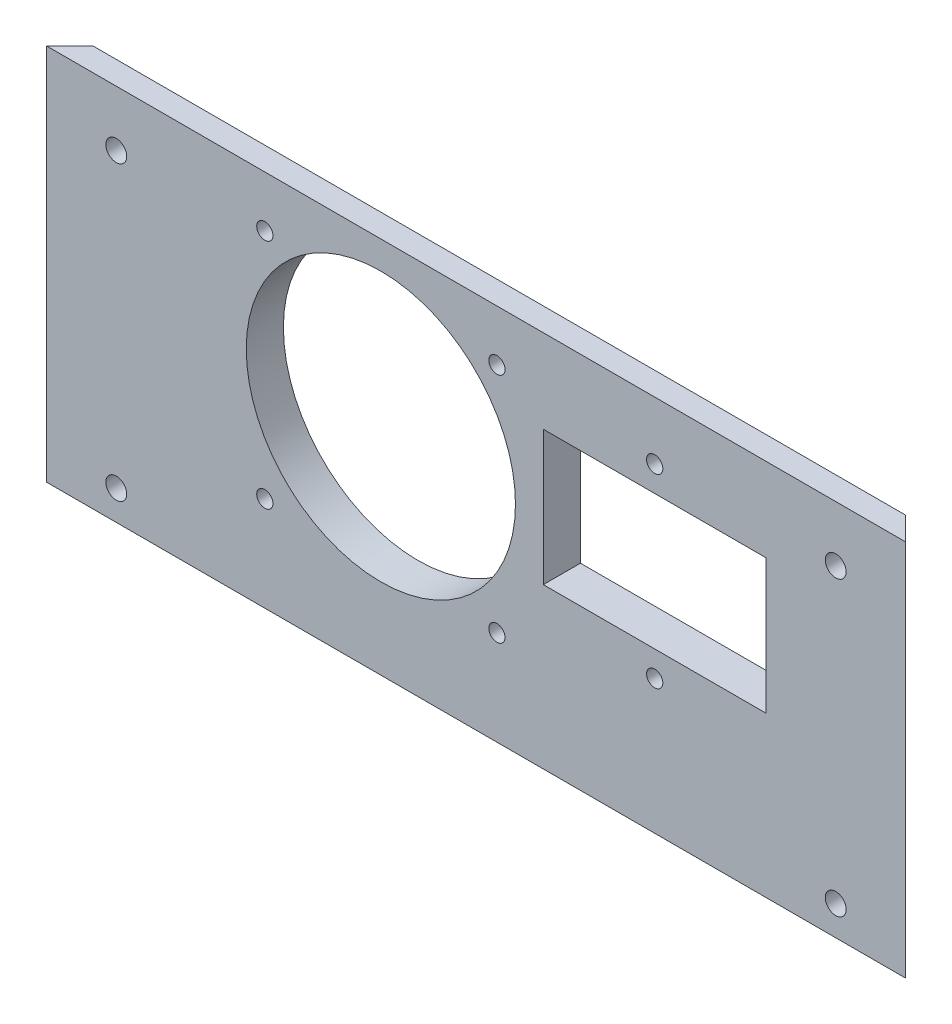
ISO-10303-21;
HEADER;
FILE_DESCRIPTION(('STEP AP214'),'2;1');
FILE_NAME('part.step','',(''),(''),'','','');
FILE_SCHEMA(('AUTOMOTIVE_DESIGN { 1 0 10303 214 1 1 1 1 }'));
ENDSEC;
DATA;
#1=APPLICATION_CONTEXT('core data for automotive mechanical design processes');
#2=APPLICATION_PROTOCOL_DEFINITION('international standard','automotive_design',2000,#1);
#3=PRODUCT_CONTEXT('',#1,'mechanical');
#4=PRODUCT('Part','Part','',(#3));
#5=PRODUCT_RELATED_PRODUCT_CATEGORY('part','',(#4));
#6=PRODUCT_DEFINITION_FORMATION('','',#4);
#7=PRODUCT_DEFINITION_CONTEXT('part definition',#1,'design');
#8=PRODUCT_DEFINITION('design','',#6,#7);
#9=PRODUCT_DEFINITION_SHAPE('','',#8);
#10=(LENGTH_UNIT() NAMED_UNIT(*) SI_UNIT(.MILLI.,.METRE.));
#11=(NAMED_UNIT(*) PLANE_ANGLE_UNIT() SI_UNIT($,.RADIAN.));
#12=(NAMED_UNIT(*) SI_UNIT($,.STERADIAN.) SOLID_ANGLE_UNIT());
#13=UNCERTAINTY_MEASURE_WITH_UNIT(LENGTH_MEASURE(1.E-05),#10,'distance_accuracy_value','');
#14=(GEOMETRIC_REPRESENTATION_CONTEXT(3) GLOBAL_UNCERTAINTY_ASSIGNED_CONTEXT((#13)) GLOBAL_UNIT_ASSIGNED_CONTEXT((#10,
#11,#12)) REPRESENTATION_CONTEXT('',''));
#15=CARTESIAN_POINT('',(0.,0.,0.));
#16=DIRECTION('',(0.,0.,1.));
#17=DIRECTION('',(1.,0.,0.));
#18=AXIS2_PLACEMENT_3D('',#15,#16,#17);
#19=CARTESIAN_POINT('',(0.,84.,-5.));
#20=DIRECTION('',(0.,1.,0.));
#21=DIRECTION('',(0.,0.,1.));
#22=AXIS2_PLACEMENT_3D('',#19,#20,#21);
#23=PLANE('',#22);
#24=DIRECTION('',(-0.707106781186546,0.,-0.707106781186549));
#25=VECTOR('',#24,1.);
#26=CARTESIAN_POINT('',(90.0000000000003,84.,-95.));
#27=LINE('',#26,#25);
#28=CARTESIAN_POINT('',(185.,84.,0.));
#29=VERTEX_POINT('',#28);
#30=CARTESIAN_POINT('',(180.,84.,-4.99999999999999));
#31=VERTEX_POINT('',#30);
#32=EDGE_CURVE('E261',#29,#31,#27,.T.);
#33=ORIENTED_EDGE('',*,*,#32,.T.);
#34=DIRECTION('',(-1.,0.,0.));
#35=VECTOR('',#34,1.);
#36=CARTESIAN_POINT('',(8.00000000000001,84.,-5.));
#37=LINE('',#36,#35);
#38=CARTESIAN_POINT('',(5.00000000000002,84.,-5.));
#39=VERTEX_POINT('',#38);
#40=EDGE_CURVE('E272',#31,#39,#37,.T.);
#41=ORIENTED_EDGE('',*,*,#40,.T.);
#42=DIRECTION('',(-0.707106781186546,0.,0.707106781186549));
#43=VECTOR('',#42,1.);
#44=CARTESIAN_POINT('',(2.50000000000002,84.,-2.49999999999999));
#45=LINE('',#44,#43);
#46=CARTESIAN_POINT('',(0.,84.,0.));
#47=VERTEX_POINT('',#46);
#48=EDGE_CURVE('E258',#39,#47,#45,.T.);
#49=ORIENTED_EDGE('',*,*,#48,.T.);
#50=DIRECTION('',(-1.,0.,0.));
#51=VECTOR('',#50,1.);
#52=CARTESIAN_POINT('',(0.,84.,0.));
#53=LINE('',#52,#51);
#54=EDGE_CURVE('E234',#29,#47,#53,.T.);
#55=ORIENTED_EDGE('',*,*,#54,.F.);
#56=EDGE_LOOP('',(#33,#41,#49,#55));
#57=FACE_BOUND('',#56,.T.);
#58=ADVANCED_FACE('F41',(#57),#23,.T.);
#59=CARTESIAN_POINT('',(0.,0.,-5.));
#60=DIRECTION('',(0.,0.,-1.));
#61=DIRECTION('',(-1.,0.,0.));
#62=AXIS2_PLACEMENT_3D('',#59,#60,#61);
#63=PLANE('',#62);
#64=DIRECTION('',(1.,0.,0.));
#65=VECTOR('',#64,1.);
#66=CARTESIAN_POINT('',(-4.99999999999998,2.59999999999997,-4.99999999999985));
#67=LINE('',#66,#65);
#68=CARTESIAN_POINT('',(4.99999999999987,2.59999999999997,-4.99999999999985));
#69=VERTEX_POINT('',#68);
#70=CARTESIAN_POINT('',(180.,2.59999999999997,-4.99999999999985));
#71=VERTEX_POINT('',#70);
#72=EDGE_CURVE('E180',#69,#71,#67,.T.);
#73=ORIENTED_EDGE('',*,*,#72,.F.);
#74=DIRECTION('',(0.,1.,0.));
#75=VECTOR('',#74,1.);
#76=CARTESIAN_POINT('',(5.00000000000002,0.,-5.));
#77=LINE('',#76,#75);
#78=CARTESIAN_POINT('',(5.00000000000002,5.,-5.));
#79=VERTEX_POINT('',#78);
#80=EDGE_CURVE('E251',#69,#79,#77,.T.);
#81=ORIENTED_EDGE('',*,*,#80,.T.);
#82=DIRECTION('',(-1.,0.,0.));
#83=VECTOR('',#82,1.);
#84=CARTESIAN_POINT('',(0.,5.,-5.));
#85=LINE('',#84,#83);
#86=CARTESIAN_POINT('',(180.,4.99999999999997,-5.));
#87=VERTEX_POINT('',#86);
#88=EDGE_CURVE('E203',#87,#79,#85,.T.);
#89=ORIENTED_EDGE('',*,*,#88,.F.);
#90=DIRECTION('',(0.,-1.,0.));
#91=VECTOR('',#90,1.);
#92=CARTESIAN_POINT('',(180.,0.,-5.));
#93=LINE('',#92,#91);
#94=EDGE_CURVE('E254',#87,#71,#93,.T.);
#95=ORIENTED_EDGE('',*,*,#94,.T.);
#96=EDGE_LOOP('',(#73,#81,#89,#95));
#97=FACE_BOUND('',#96,.T.);
#98=ADVANCED_FACE('F304',(#97),#63,.T.);
#99=CARTESIAN_POINT('',(0.,0.,0.));
#100=DIRECTION('',(0.,0.,-1.));
#101=DIRECTION('',(-1.,0.,0.));
#102=AXIS2_PLACEMENT_3D('',#99,#100,#101);
#103=PLANE('',#102);
#104=CARTESIAN_POINT('',(97.0000000000003,23.,0.));
#105=DIRECTION('',(0.,0.,1.));
#106=DIRECTION('',(1.,0.,0.));
#107=AXIS2_PLACEMENT_3D('',#104,#105,#106);
#108=CIRCLE('',#107,1.75);
#109=CARTESIAN_POINT('',(98.7500000000003,23.,0.));
#110=VERTEX_POINT('',#109);
#111=EDGE_CURVE('E402',#110,#110,#108,.T.);
#112=ORIENTED_EDGE('',*,*,#111,.F.);
#113=EDGE_LOOP('',(#112));
#114=FACE_BOUND('',#113,.T.);
#115=CARTESIAN_POINT('',(96.9999999999998,73.,0.));
#116=DIRECTION('',(0.,0.,1.));
#117=DIRECTION('',(1.,0.,0.));
#118=AXIS2_PLACEMENT_3D('',#115,#116,#117);
#119=CIRCLE('',#118,1.75);
#120=CARTESIAN_POINT('',(98.7499999999998,73.,0.));
#121=VERTEX_POINT('',#120);
#122=EDGE_CURVE('E419',#121,#121,#119,.T.);
#123=ORIENTED_EDGE('',*,*,#122,.F.);
#124=EDGE_LOOP('',(#123));
#125=FACE_BOUND('',#124,.T.);
#126=CARTESIAN_POINT('',(71.9999999999995,49.,0.));
#127=DIRECTION('',(0.,0.,1.));
#128=DIRECTION('',(1.,0.,0.));
#129=AXIS2_PLACEMENT_3D('',#126,#127,#128);
#130=CIRCLE('',#129,29.);
#131=CARTESIAN_POINT('',(101.,49.,0.));
#132=VERTEX_POINT('',#131);
#133=EDGE_CURVE('E153',#132,#132,#130,.T.);
#134=ORIENTED_EDGE('',*,*,#133,.F.);
#135=EDGE_LOOP('',(#134));
#136=FACE_BOUND('',#135,.T.);
#137=CARTESIAN_POINT('',(46.9999999999998,73.,0.));
#138=DIRECTION('',(0.,0.,1.));
#139=DIRECTION('',(1.,0.,0.));
#140=AXIS2_PLACEMENT_3D('',#137,#138,#139);
#141=CIRCLE('',#140,1.75);
#142=CARTESIAN_POINT('',(48.7499999999998,73.,0.));
#143=VERTEX_POINT('',#142);
#144=EDGE_CURVE('E418',#143,#143,#141,.T.);
#145=ORIENTED_EDGE('',*,*,#144,.F.);
#146=EDGE_LOOP('',(#145));
#147=FACE_BOUND('',#146,.T.);
#148=CARTESIAN_POINT('',(131.,31.5,0.));
#149=DIRECTION('',(0.,0.,1.));
#150=DIRECTION('',(1.,0.,0.));
#151=AXIS2_PLACEMENT_3D('',#148,#149,#150);
#152=CIRCLE('',#151,1.75000000000001);
#153=CARTESIAN_POINT('',(132.75,31.5,0.));
#154=VERTEX_POINT('',#153);
#155=EDGE_CURVE('E390',#154,#154,#152,.T.);
#156=ORIENTED_EDGE('',*,*,#155,.F.);
#157=EDGE_LOOP('',(#156));
#158=FACE_BOUND('',#157,.T.);
#159=CARTESIAN_POINT('',(131.,71.5,0.));
#160=DIRECTION('',(0.,0.,1.));
#161=DIRECTION('',(1.,0.,0.));
#162=AXIS2_PLACEMENT_3D('',#159,#160,#161);
#163=CIRCLE('',#162,1.75000000000001);
#164=CARTESIAN_POINT('',(132.75,71.5,0.));
#165=VERTEX_POINT('',#164);
#166=EDGE_CURVE('E395',#165,#165,#163,.T.);
#167=ORIENTED_EDGE('',*,*,#166,.F.);
#168=EDGE_LOOP('',(#167));
#169=FACE_BOUND('',#168,.T.);
#170=CARTESIAN_POINT('',(47.0000000000003,23.,0.));
#171=DIRECTION('',(0.,0.,1.));
#172=DIRECTION('',(1.,0.,0.));
#173=AXIS2_PLACEMENT_3D('',#170,#171,#172);
#174=CIRCLE('',#173,1.75);
#175=CARTESIAN_POINT('',(48.7500000000003,23.,0.));
#176=VERTEX_POINT('',#175);
#177=EDGE_CURVE('E403',#176,#176,#174,.T.);
#178=ORIENTED_EDGE('',*,*,#177,.F.);
#179=EDGE_LOOP('',(#178));
#180=FACE_BOUND('',#179,.T.);
#181=DIRECTION('',(1.,0.,0.));
#182=VECTOR('',#181,1.);
#183=CARTESIAN_POINT('',(107.,37.,0.));
#184=LINE('',#183,#182);
#185=CARTESIAN_POINT('',(107.,37.,0.));
#186=VERTEX_POINT('',#185);
#187=CARTESIAN_POINT('',(155.,37.,0.));
#188=VERTEX_POINT('',#187);
#189=EDGE_CURVE('E162',#186,#188,#184,.T.);
#190=ORIENTED_EDGE('',*,*,#189,.F.);
#191=DIRECTION('',(0.,-1.,0.));
#192=VECTOR('',#191,1.);
#193=CARTESIAN_POINT('',(107.,37.,0.));
#194=LINE('',#193,#192);
#195=CARTESIAN_POINT('',(107.,66.,0.));
#196=VERTEX_POINT('',#195);
#197=EDGE_CURVE('E58',#196,#186,#194,.T.);
#198=ORIENTED_EDGE('',*,*,#197,.F.);
#199=DIRECTION('',(-1.,0.,0.));
#200=VECTOR('',#199,1.);
#201=CARTESIAN_POINT('',(107.,66.,0.));
#202=LINE('',#201,#200);
#203=CARTESIAN_POINT('',(155.,66.,0.));
#204=VERTEX_POINT('',#203);
#205=EDGE_CURVE('E146',#204,#196,#202,.T.);
#206=ORIENTED_EDGE('',*,*,#205,.F.);
#207=DIRECTION('',(0.,1.,0.));
#208=VECTOR('',#207,1.);
#209=CARTESIAN_POINT('',(155.,37.,0.));
#210=LINE('',#209,#208);
#211=EDGE_CURVE('E150',#188,#204,#210,.T.);
#212=ORIENTED_EDGE('',*,*,#211,.F.);
#213=EDGE_LOOP('',(#190,#198,#206,#212));
#214=FACE_BOUND('',#213,.T.);
#215=CARTESIAN_POINT('',(170.,72.,0.));
#216=DIRECTION('',(0.,0.,1.));
#217=DIRECTION('',(-1.,0.,0.));
#218=AXIS2_PLACEMENT_3D('',#215,#216,#217);
#219=CIRCLE('',#218,2.25000000000004);
#220=CARTESIAN_POINT('',(167.75,72.,0.));
#221=VERTEX_POINT('',#220);
#222=EDGE_CURVE('E208',#221,#221,#219,.T.);
#223=ORIENTED_EDGE('',*,*,#222,.F.);
#224=EDGE_LOOP('',(#223));
#225=FACE_BOUND('',#224,.T.);
#226=CARTESIAN_POINT('',(15.,72.,0.));
#227=DIRECTION('',(0.,0.,1.));
#228=DIRECTION('',(1.,0.,0.));
#229=AXIS2_PLACEMENT_3D('',#226,#227,#228);
#230=CIRCLE('',#229,2.25000000000001);
#231=CARTESIAN_POINT('',(17.25,72.,0.));
#232=VERTEX_POINT('',#231);
#233=EDGE_CURVE('E215',#232,#232,#230,.T.);
#234=ORIENTED_EDGE('',*,*,#233,.F.);
#235=EDGE_LOOP('',(#234));
#236=FACE_BOUND('',#235,.T.);
#237=CARTESIAN_POINT('',(170.,9.,0.));
#238=DIRECTION('',(0.,0.,1.));
#239=DIRECTION('',(-1.,0.,0.));
#240=AXIS2_PLACEMENT_3D('',#237,#238,#239);
#241=CIRCLE('',#240,2.25000000000004);
#242=CARTESIAN_POINT('',(167.75,9.,0.));
#243=VERTEX_POINT('',#242);
#244=EDGE_CURVE('E219',#243,#243,#241,.T.);
#245=ORIENTED_EDGE('',*,*,#244,.F.);
#246=EDGE_LOOP('',(#245));
#247=FACE_BOUND('',#246,.T.);
#248=CARTESIAN_POINT('',(15.,9.,0.));
#249=DIRECTION('',(0.,0.,1.));
#250=DIRECTION('',(1.,0.,0.));
#251=AXIS2_PLACEMENT_3D('',#248,#249,#250);
#252=CIRCLE('',#251,2.25);
#253=CARTESIAN_POINT('',(17.25,9.,0.));
#254=VERTEX_POINT('',#253);
#255=EDGE_CURVE('E223',#254,#254,#252,.T.);
#256=ORIENTED_EDGE('',*,*,#255,.F.);
#257=EDGE_LOOP('',(#256));
#258=FACE_BOUND('',#257,.T.);
#259=DIRECTION('',(0.,-1.,0.));
#260=VECTOR('',#259,1.);
#261=CARTESIAN_POINT('',(0.,0.,0.));
#262=LINE('',#261,#260);
#263=CARTESIAN_POINT('',(0.,2.59999999999997,0.));
#264=VERTEX_POINT('',#263);
#265=EDGE_CURVE('E227',#47,#264,#262,.T.);
#266=ORIENTED_EDGE('',*,*,#265,.T.);
#267=DIRECTION('',(1.,0.,0.));
#268=VECTOR('',#267,1.);
#269=CARTESIAN_POINT('',(0.,2.59999999999997,1.66533453693773E-13));
#270=LINE('',#269,#268);
#271=CARTESIAN_POINT('',(185.,2.59999999999997,1.66533453693773E-13));
#272=VERTEX_POINT('',#271);
#273=EDGE_CURVE('E181',#264,#272,#270,.T.);
#274=ORIENTED_EDGE('',*,*,#273,.T.);
#275=DIRECTION('',(0.,1.,0.));
#276=VECTOR('',#275,1.);
#277=CARTESIAN_POINT('',(185.,0.,0.));
#278=LINE('',#277,#276);
#279=EDGE_CURVE('E231',#272,#29,#278,.T.);
#280=ORIENTED_EDGE('',*,*,#279,.T.);
#281=ORIENTED_EDGE('',*,*,#54,.T.);
#282=EDGE_LOOP('',(#266,#274,#280,#281));
#283=FACE_BOUND('',#282,.T.);
#284=ADVANCED_FACE('F298',(#114,#125,#136,#147,#158,#169,#180,#214,#225,#236,#247,#258,#283),
#103,.F.);
#285=CARTESIAN_POINT('',(15.,9.,-5.));
#286=DIRECTION('',(0.,0.,1.));
#287=DIRECTION('',(1.,0.,0.));
#288=AXIS2_PLACEMENT_3D('',#285,#286,#287);
#289=CYLINDRICAL_SURFACE('',#288,2.25);
#290=ORIENTED_EDGE('',*,*,#255,.T.);
#291=EDGE_LOOP('',(#290));
#292=FACE_BOUND('',#291,.T.);
#293=CARTESIAN_POINT('',(15.,9.,-8.));
#294=DIRECTION('',(0.,0.,-1.));
#295=DIRECTION('',(-1.,0.,0.));
#296=AXIS2_PLACEMENT_3D('',#293,#294,#295);
#297=CIRCLE('',#296,2.25);
#298=CARTESIAN_POINT('',(12.75,9.,-8.));
#299=VERTEX_POINT('',#298);
#300=EDGE_CURVE('E195',#299,#299,#297,.T.);
#301=ORIENTED_EDGE('',*,*,#300,.T.);
#302=EDGE_LOOP('',(#301));
#303=FACE_BOUND('',#302,.T.);
#304=ADVANCED_FACE('F447',(#292,#303),#289,.F.);
#305=CARTESIAN_POINT('',(170.,9.,-5.));
#306=DIRECTION('',(0.,0.,1.));
#307=DIRECTION('',(1.,0.,0.));
#308=AXIS2_PLACEMENT_3D('',#305,#306,#307);
#309=CYLINDRICAL_SURFACE('',#308,2.25000000000004);
#310=ORIENTED_EDGE('',*,*,#244,.T.);
#311=EDGE_LOOP('',(#310));
#312=FACE_BOUND('',#311,.T.);
#313=CARTESIAN_POINT('',(170.,9.,-8.));
#314=DIRECTION('',(0.,0.,-1.));
#315=DIRECTION('',(-1.,0.,0.));
#316=AXIS2_PLACEMENT_3D('',#313,#314,#315);
#317=CIRCLE('',#316,2.25000000000004);
#318=CARTESIAN_POINT('',(167.75,9.,-8.));
#319=VERTEX_POINT('',#318);
#320=EDGE_CURVE('E191',#319,#319,#317,.T.);
#321=ORIENTED_EDGE('',*,*,#320,.T.);
#322=EDGE_LOOP('',(#321));
#323=FACE_BOUND('',#322,.T.);
#324=ADVANCED_FACE('F467',(#312,#323),#309,.F.);
#325=CARTESIAN_POINT('',(15.,72.,-5.));
#326=DIRECTION('',(0.,0.,1.));
#327=DIRECTION('',(1.,0.,0.));
#328=AXIS2_PLACEMENT_3D('',#325,#326,#327);
#329=CYLINDRICAL_SURFACE('',#328,2.25000000000001);
#330=ORIENTED_EDGE('',*,*,#233,.T.);
#331=EDGE_LOOP('',(#330));
#332=FACE_BOUND('',#331,.T.);
#333=CARTESIAN_POINT('',(15.,72.,-8.));
#334=DIRECTION('',(0.,0.,-1.));
#335=DIRECTION('',(-1.,0.,0.));
#336=AXIS2_PLACEMENT_3D('',#333,#334,#335);
#337=CIRCLE('',#336,2.25000000000001);
#338=CARTESIAN_POINT('',(12.75,72.,-8.));
#339=VERTEX_POINT('',#338);
#340=EDGE_CURVE('E199',#339,#339,#337,.T.);
#341=ORIENTED_EDGE('',*,*,#340,.T.);
#342=EDGE_LOOP('',(#341));
#343=FACE_BOUND('',#342,.T.);
#344=ADVANCED_FACE('F477',(#332,#343),#329,.F.);
#345=CARTESIAN_POINT('',(170.,72.,-5.));
#346=DIRECTION('',(0.,0.,1.));
#347=DIRECTION('',(1.,0.,0.));
#348=AXIS2_PLACEMENT_3D('',#345,#346,#347);
#349=CYLINDRICAL_SURFACE('',#348,2.25000000000004);
#350=ORIENTED_EDGE('',*,*,#222,.T.);
#351=EDGE_LOOP('',(#350));
#352=FACE_BOUND('',#351,.T.);
#353=CARTESIAN_POINT('',(170.,72.,-8.));
#354=DIRECTION('',(0.,0.,-1.));
#355=DIRECTION('',(-1.,0.,0.));
#356=AXIS2_PLACEMENT_3D('',#353,#354,#355);
#357=CIRCLE('',#356,2.25000000000004);
#358=CARTESIAN_POINT('',(167.75,72.,-8.));
#359=VERTEX_POINT('',#358);
#360=EDGE_CURVE('E185',#359,#359,#357,.T.);
#361=ORIENTED_EDGE('',*,*,#360,.T.);
#362=EDGE_LOOP('',(#361));
#363=FACE_BOUND('',#362,.T.);
#364=ADVANCED_FACE('F316',(#352,#363),#349,.F.);
#365=CARTESIAN_POINT('',(0.,0.,-8.));
#366=DIRECTION('',(0.,0.,1.));
#367=DIRECTION('',(1.,0.,0.));
#368=AXIS2_PLACEMENT_3D('',#365,#366,#367);
#369=PLANE('',#368);
#370=CARTESIAN_POINT('',(97.0000000000003,23.,-8.));
#371=DIRECTION('',(0.,0.,1.));
#372=DIRECTION('',(1.,0.,0.));
#373=AXIS2_PLACEMENT_3D('',#370,#371,#372);
#374=CIRCLE('',#373,1.75);
#375=CARTESIAN_POINT('',(98.7500000000003,23.,-8.));
#376=VERTEX_POINT('',#375);
#377=EDGE_CURVE('E423',#376,#376,#374,.T.);
#378=ORIENTED_EDGE('',*,*,#377,.T.);
#379=EDGE_LOOP('',(#378));
#380=FACE_BOUND('',#379,.T.);
#381=CARTESIAN_POINT('',(96.9999999999998,73.,-8.));
#382=DIRECTION('',(0.,0.,1.));
#383=DIRECTION('',(1.,0.,0.));
#384=AXIS2_PLACEMENT_3D('',#381,#382,#383);
#385=CIRCLE('',#384,1.75);
#386=CARTESIAN_POINT('',(98.7499999999998,73.,-8.));
#387=VERTEX_POINT('',#386);
#388=EDGE_CURVE('E414',#387,#387,#385,.T.);
#389=ORIENTED_EDGE('',*,*,#388,.T.);
#390=EDGE_LOOP('',(#389));
#391=FACE_BOUND('',#390,.T.);
#392=CARTESIAN_POINT('',(71.9999999999995,49.,-8.));
#393=DIRECTION('',(0.,0.,1.));
#394=DIRECTION('',(1.,0.,0.));
#395=AXIS2_PLACEMENT_3D('',#392,#393,#394);
#396=CIRCLE('',#395,29.);
#397=CARTESIAN_POINT('',(101.,49.,-8.));
#398=VERTEX_POINT('',#397);
#399=EDGE_CURVE('E163',#398,#398,#396,.T.);
#400=ORIENTED_EDGE('',*,*,#399,.T.);
#401=EDGE_LOOP('',(#400));
#402=FACE_BOUND('',#401,.T.);
#403=CARTESIAN_POINT('',(46.9999999999998,73.,-8.));
#404=DIRECTION('',(0.,0.,1.));
#405=DIRECTION('',(1.,0.,0.));
#406=AXIS2_PLACEMENT_3D('',#403,#404,#405);
#407=CIRCLE('',#406,1.75);
#408=CARTESIAN_POINT('',(48.7499999999998,73.,-8.));
#409=VERTEX_POINT('',#408);
#410=EDGE_CURVE('E430',#409,#409,#407,.T.);
#411=ORIENTED_EDGE('',*,*,#410,.T.);
#412=EDGE_LOOP('',(#411));
#413=FACE_BOUND('',#412,.T.);
#414=CARTESIAN_POINT('',(131.,31.5,-8.));
#415=DIRECTION('',(0.,0.,1.));
#416=DIRECTION('',(1.,0.,0.));
#417=AXIS2_PLACEMENT_3D('',#414,#415,#416);
#418=CIRCLE('',#417,1.75000000000001);
#419=CARTESIAN_POINT('',(132.75,31.5,-8.));
#420=VERTEX_POINT('',#419);
#421=EDGE_CURVE('E387',#420,#420,#418,.T.);
#422=ORIENTED_EDGE('',*,*,#421,.T.);
#423=EDGE_LOOP('',(#422));
#424=FACE_BOUND('',#423,.T.);
#425=CARTESIAN_POINT('',(131.,71.5,-8.));
#426=DIRECTION('',(0.,0.,1.));
#427=DIRECTION('',(1.,0.,0.));
#428=AXIS2_PLACEMENT_3D('',#425,#426,#427);
#429=CIRCLE('',#428,1.75000000000001);
#430=CARTESIAN_POINT('',(132.75,71.5,-8.));
#431=VERTEX_POINT('',#430);
#432=EDGE_CURVE('E407',#431,#431,#429,.T.);
#433=ORIENTED_EDGE('',*,*,#432,.T.);
#434=EDGE_LOOP('',(#433));
#435=FACE_BOUND('',#434,.T.);
#436=CARTESIAN_POINT('',(47.0000000000003,23.,-8.));
#437=DIRECTION('',(0.,0.,1.));
#438=DIRECTION('',(1.,0.,0.));
#439=AXIS2_PLACEMENT_3D('',#436,#437,#438);
#440=CIRCLE('',#439,1.75);
#441=CARTESIAN_POINT('',(48.7500000000003,23.,-8.));
#442=VERTEX_POINT('',#441);
#443=EDGE_CURVE('E398',#442,#442,#440,.T.);
#444=ORIENTED_EDGE('',*,*,#443,.T.);
#445=EDGE_LOOP('',(#444));
#446=FACE_BOUND('',#445,.T.);
#447=DIRECTION('',(-1.,0.,0.));
#448=VECTOR('',#447,1.);
#449=CARTESIAN_POINT('',(107.,66.,-8.));
#450=LINE('',#449,#448);
#451=CARTESIAN_POINT('',(155.,66.,-8.));
#452=VERTEX_POINT('',#451);
#453=CARTESIAN_POINT('',(107.,66.,-8.));
#454=VERTEX_POINT('',#453);
#455=EDGE_CURVE('E134',#452,#454,#450,.T.);
#456=ORIENTED_EDGE('',*,*,#455,.T.);
#457=DIRECTION('',(0.,-1.,0.));
#458=VECTOR('',#457,1.);
#459=CARTESIAN_POINT('',(107.,37.,-8.));
#460=LINE('',#459,#458);
#461=CARTESIAN_POINT('',(107.,37.,-8.));
#462=VERTEX_POINT('',#461);
#463=EDGE_CURVE('E127',#454,#462,#460,.T.);
#464=ORIENTED_EDGE('',*,*,#463,.T.);
#465=DIRECTION('',(1.,0.,0.));
#466=VECTOR('',#465,1.);
#467=CARTESIAN_POINT('',(107.,37.,-8.));
#468=LINE('',#467,#466);
#469=CARTESIAN_POINT('',(155.,37.,-8.));
#470=VERTEX_POINT('',#469);
#471=EDGE_CURVE('E137',#462,#470,#468,.T.);
#472=ORIENTED_EDGE('',*,*,#471,.T.);
#473=DIRECTION('',(0.,1.,0.));
#474=VECTOR('',#473,1.);
#475=CARTESIAN_POINT('',(155.,37.,-8.));
#476=LINE('',#475,#474);
#477=EDGE_CURVE('E66',#470,#452,#476,.T.);
#478=ORIENTED_EDGE('',*,*,#477,.T.);
#479=EDGE_LOOP('',(#456,#464,#472,#478));
#480=FACE_BOUND('',#479,.T.);
#481=DIRECTION('',(0.,1.,0.));
#482=VECTOR('',#481,1.);
#483=CARTESIAN_POINT('',(8.00000000000001,84.,-8.));
#484=LINE('',#483,#482);
#485=CARTESIAN_POINT('',(8.00000000000001,5.,-8.));
#486=VERTEX_POINT('',#485);
#487=CARTESIAN_POINT('',(8.00000000000001,81.,-8.));
#488=VERTEX_POINT('',#487);
#489=EDGE_CURVE('E238',#486,#488,#484,.T.);
#490=ORIENTED_EDGE('',*,*,#489,.T.);
#491=DIRECTION('',(1.,0.,0.));
#492=VECTOR('',#491,1.);
#493=CARTESIAN_POINT('',(177.,81.,-8.));
#494=LINE('',#493,#492);
#495=CARTESIAN_POINT('',(177.,81.,-8.));
#496=VERTEX_POINT('',#495);
#497=EDGE_CURVE('E265',#488,#496,#494,.T.);
#498=ORIENTED_EDGE('',*,*,#497,.T.);
#499=DIRECTION('',(0.,-1.,0.));
#500=VECTOR('',#499,1.);
#501=CARTESIAN_POINT('',(177.,4.99999999999997,-8.));
#502=LINE('',#501,#500);
#503=CARTESIAN_POINT('',(177.,4.99999999999997,-8.));
#504=VERTEX_POINT('',#503);
#505=EDGE_CURVE('E242',#496,#504,#502,.T.);
#506=ORIENTED_EDGE('',*,*,#505,.T.);
#507=DIRECTION('',(-1.,0.,0.));
#508=VECTOR('',#507,1.);
#509=CARTESIAN_POINT('',(0.,5.,-8.));
#510=LINE('',#509,#508);
#511=EDGE_CURVE('E204',#504,#486,#510,.T.);
#512=ORIENTED_EDGE('',*,*,#511,.T.);
#513=EDGE_LOOP('',(#490,#498,#506,#512));
#514=FACE_BOUND('',#513,.T.);
#515=ORIENTED_EDGE('',*,*,#340,.F.);
#516=EDGE_LOOP('',(#515));
#517=FACE_BOUND('',#516,.T.);
#518=ORIENTED_EDGE('',*,*,#300,.F.);
#519=EDGE_LOOP('',(#518));
#520=FACE_BOUND('',#519,.T.);
#521=ORIENTED_EDGE('',*,*,#320,.F.);
#522=EDGE_LOOP('',(#521));
#523=FACE_BOUND('',#522,.T.);
#524=ORIENTED_EDGE('',*,*,#360,.F.);
#525=EDGE_LOOP('',(#524));
#526=FACE_BOUND('',#525,.T.);
#527=ADVANCED_FACE('F142',(#380,#391,#402,#413,#424,#435,#446,#480,#514,#517,#520,#523,#526),
#369,.F.);
#528=CARTESIAN_POINT('',(0.,5.,-8.));
#529=DIRECTION('',(0.,1.,0.));
#530=DIRECTION('',(-1.,0.,0.));
#531=AXIS2_PLACEMENT_3D('',#528,#529,#530);
#532=PLANE('',#531);
#533=ORIENTED_EDGE('',*,*,#511,.F.);
#534=DIRECTION('',(0.707106781186546,0.,0.707106781186549));
#535=VECTOR('',#534,1.);
#536=CARTESIAN_POINT('',(177.,4.99999999999997,-8.));
#537=LINE('',#536,#535);
#538=EDGE_CURVE('E248',#504,#87,#537,.T.);
#539=ORIENTED_EDGE('',*,*,#538,.T.);
#540=ORIENTED_EDGE('',*,*,#88,.T.);
#541=DIRECTION('',(0.707106781186546,0.,-0.707106781186549));
#542=VECTOR('',#541,1.);
#543=CARTESIAN_POINT('',(8.00000000000001,5.,-8.));
#544=LINE('',#543,#542);
#545=EDGE_CURVE('E245',#79,#486,#544,.T.);
#546=ORIENTED_EDGE('',*,*,#545,.T.);
#547=EDGE_LOOP('',(#533,#539,#540,#546));
#548=FACE_BOUND('',#547,.T.);
#549=ADVANCED_FACE('F308',(#548),#532,.F.);
#550=CARTESIAN_POINT('',(177.,0.,-8.));
#551=DIRECTION('',(0.707106781186549,0.,-0.707106781186546));
#552=DIRECTION('',(0.,1.,0.));
#553=AXIS2_PLACEMENT_3D('',#550,#551,#552);
#554=PLANE('',#553);
#555=DIRECTION('',(0.707106781186545,0.,0.70710678118655));
#556=VECTOR('',#555,1.);
#557=CARTESIAN_POINT('',(185.,2.59999999999997,1.66533453693773E-13));
#558=LINE('',#557,#556);
#559=EDGE_CURVE('E172',#71,#272,#558,.T.);
#560=ORIENTED_EDGE('',*,*,#559,.F.);
#561=ORIENTED_EDGE('',*,*,#94,.F.);
#562=ORIENTED_EDGE('',*,*,#538,.F.);
#563=ORIENTED_EDGE('',*,*,#505,.F.);
#564=DIRECTION('',(0.577350269189624,0.577350269189627,0.577350269189626));
#565=VECTOR('',#564,1.);
#566=CARTESIAN_POINT('',(150.,53.9999999999999,-35.0000000000001));
#567=LINE('',#566,#565);
#568=EDGE_CURVE('E269',#496,#31,#567,.T.);
#569=ORIENTED_EDGE('',*,*,#568,.T.);
#570=ORIENTED_EDGE('',*,*,#32,.F.);
#571=ORIENTED_EDGE('',*,*,#279,.F.);
#572=EDGE_LOOP('',(#560,#561,#562,#563,#569,#570,#571));
#573=FACE_BOUND('',#572,.T.);
#574=ADVANCED_FACE('F292',(#573),#554,.T.);
#575=CARTESIAN_POINT('',(8.00000000000001,0.,-8.));
#576=DIRECTION('',(-0.707106781186549,0.,-0.707106781186546));
#577=DIRECTION('',(0.,-1.,0.));
#578=AXIS2_PLACEMENT_3D('',#575,#576,#577);
#579=PLANE('',#578);
#580=DIRECTION('',(0.707106781186546,0.,-0.707106781186549));
#581=VECTOR('',#580,1.);
#582=CARTESIAN_POINT('',(8.00000000000001,2.59999999999997,-8.));
#583=LINE('',#582,#581);
#584=EDGE_CURVE('E11',#264,#69,#583,.T.);
#585=ORIENTED_EDGE('',*,*,#584,.F.);
#586=ORIENTED_EDGE('',*,*,#265,.F.);
#587=ORIENTED_EDGE('',*,*,#48,.F.);
#588=DIRECTION('',(0.577350269189624,-0.577350269189627,-0.577350269189626));
#589=VECTOR('',#588,1.);
#590=CARTESIAN_POINT('',(35.,53.9999999999999,-35.0000000000001));
#591=LINE('',#590,#589);
#592=EDGE_CURVE('E51',#39,#488,#591,.T.);
#593=ORIENTED_EDGE('',*,*,#592,.T.);
#594=ORIENTED_EDGE('',*,*,#489,.F.);
#595=ORIENTED_EDGE('',*,*,#545,.F.);
#596=ORIENTED_EDGE('',*,*,#80,.F.);
#597=EDGE_LOOP('',(#585,#586,#587,#593,#594,#595,#596));
#598=FACE_BOUND('',#597,.T.);
#599=ADVANCED_FACE('F280',(#598),#579,.T.);
#600=CARTESIAN_POINT('',(0.,81.,-8.));
#601=DIRECTION('',(0.,0.707106781186547,-0.707106781186548));
#602=DIRECTION('',(-1.,0.,0.));
#603=AXIS2_PLACEMENT_3D('',#600,#601,#602);
#604=PLANE('',#603);
#605=ORIENTED_EDGE('',*,*,#592,.F.);
#606=ORIENTED_EDGE('',*,*,#40,.F.);
#607=ORIENTED_EDGE('',*,*,#568,.F.);
#608=ORIENTED_EDGE('',*,*,#497,.F.);
#609=EDGE_LOOP('',(#605,#606,#607,#608));
#610=FACE_BOUND('',#609,.T.);
#611=ADVANCED_FACE('F44',(#610),#604,.T.);
#612=CARTESIAN_POINT('',(0.,2.59999999999997,1.66533453693773E-13));
#613=DIRECTION('',(0.,1.,0.));
#614=DIRECTION('',(-1.,0.,0.));
#615=AXIS2_PLACEMENT_3D('',#612,#613,#614);
#616=PLANE('',#615);
#617=ORIENTED_EDGE('',*,*,#584,.T.);
#618=ORIENTED_EDGE('',*,*,#72,.T.);
#619=ORIENTED_EDGE('',*,*,#559,.T.);
#620=ORIENTED_EDGE('',*,*,#273,.F.);
#621=EDGE_LOOP('',(#617,#618,#619,#620));
#622=FACE_BOUND('',#621,.T.);
#623=ADVANCED_FACE('F302',(#622),#616,.F.);
#624=CARTESIAN_POINT('',(107.,37.,-8.));
#625=DIRECTION('',(-1.,0.,0.));
#626=DIRECTION('',(0.,0.,1.));
#627=AXIS2_PLACEMENT_3D('',#624,#625,#626);
#628=PLANE('',#627);
#629=ORIENTED_EDGE('',*,*,#197,.T.);
#630=DIRECTION('',(0.,0.,1.));
#631=VECTOR('',#630,1.);
#632=CARTESIAN_POINT('',(107.,37.,-8.));
#633=LINE('',#632,#631);
#634=EDGE_CURVE('E123',#462,#186,#633,.T.);
#635=ORIENTED_EDGE('',*,*,#634,.F.);
#636=ORIENTED_EDGE('',*,*,#463,.F.);
#637=DIRECTION('',(0.,0.,1.));
#638=VECTOR('',#637,1.);
#639=CARTESIAN_POINT('',(107.,66.,-8.));
#640=LINE('',#639,#638);
#641=EDGE_CURVE('E169',#454,#196,#640,.T.);
#642=ORIENTED_EDGE('',*,*,#641,.T.);
#643=EDGE_LOOP('',(#629,#635,#636,#642));
#644=FACE_BOUND('',#643,.T.);
#645=ADVANCED_FACE('F125',(#644),#628,.F.);
#646=CARTESIAN_POINT('',(107.,66.,-8.));
#647=DIRECTION('',(0.,1.,0.));
#648=DIRECTION('',(0.,0.,1.));
#649=AXIS2_PLACEMENT_3D('',#646,#647,#648);
#650=PLANE('',#649);
#651=ORIENTED_EDGE('',*,*,#205,.T.);
#652=ORIENTED_EDGE('',*,*,#641,.F.);
#653=ORIENTED_EDGE('',*,*,#455,.F.);
#654=DIRECTION('',(0.,0.,1.));
#655=VECTOR('',#654,1.);
#656=CARTESIAN_POINT('',(155.,66.,-8.));
#657=LINE('',#656,#655);
#658=EDGE_CURVE('E173',#452,#204,#657,.T.);
#659=ORIENTED_EDGE('',*,*,#658,.T.);
#660=EDGE_LOOP('',(#651,#652,#653,#659));
#661=FACE_BOUND('',#660,.T.);
#662=ADVANCED_FACE('F344',(#661),#650,.F.);
#663=CARTESIAN_POINT('',(155.,37.,-8.));
#664=DIRECTION('',(1.,0.,0.));
#665=DIRECTION('',(0.,0.,-1.));
#666=AXIS2_PLACEMENT_3D('',#663,#664,#665);
#667=PLANE('',#666);
#668=ORIENTED_EDGE('',*,*,#211,.T.);
#669=ORIENTED_EDGE('',*,*,#658,.F.);
#670=ORIENTED_EDGE('',*,*,#477,.F.);
#671=DIRECTION('',(0.,0.,1.));
#672=VECTOR('',#671,1.);
#673=CARTESIAN_POINT('',(155.,37.,-8.));
#674=LINE('',#673,#672);
#675=EDGE_CURVE('E133',#470,#188,#674,.T.);
#676=ORIENTED_EDGE('',*,*,#675,.T.);
#677=EDGE_LOOP('',(#668,#669,#670,#676));
#678=FACE_BOUND('',#677,.T.);
#679=ADVANCED_FACE('F350',(#678),#667,.F.);
#680=CARTESIAN_POINT('',(107.,37.,-8.));
#681=DIRECTION('',(0.,-1.,0.));
#682=DIRECTION('',(0.,0.,-1.));
#683=AXIS2_PLACEMENT_3D('',#680,#681,#682);
#684=PLANE('',#683);
#685=ORIENTED_EDGE('',*,*,#189,.T.);
#686=ORIENTED_EDGE('',*,*,#675,.F.);
#687=ORIENTED_EDGE('',*,*,#471,.F.);
#688=ORIENTED_EDGE('',*,*,#634,.T.);
#689=EDGE_LOOP('',(#685,#686,#687,#688));
#690=FACE_BOUND('',#689,.T.);
#691=ADVANCED_FACE('F138',(#690),#684,.F.);
#692=CARTESIAN_POINT('',(47.0000000000003,23.,-8.));
#693=DIRECTION('',(0.,0.,1.));
#694=DIRECTION('',(1.,0.,0.));
#695=AXIS2_PLACEMENT_3D('',#692,#693,#694);
#696=CYLINDRICAL_SURFACE('',#695,1.75);
#697=ORIENTED_EDGE('',*,*,#443,.F.);
#698=EDGE_LOOP('',(#697));
#699=FACE_BOUND('',#698,.T.);
#700=ORIENTED_EDGE('',*,*,#177,.T.);
#701=EDGE_LOOP('',(#700));
#702=FACE_BOUND('',#701,.T.);
#703=ADVANCED_FACE('F349',(#699,#702),#696,.F.);
#704=CARTESIAN_POINT('',(131.,71.5,-8.));
#705=DIRECTION('',(0.,0.,1.));
#706=DIRECTION('',(1.,0.,0.));
#707=AXIS2_PLACEMENT_3D('',#704,#705,#706);
#708=CYLINDRICAL_SURFACE('',#707,1.75000000000001);
#709=ORIENTED_EDGE('',*,*,#432,.F.);
#710=EDGE_LOOP('',(#709));
#711=FACE_BOUND('',#710,.T.);
#712=ORIENTED_EDGE('',*,*,#166,.T.);
#713=EDGE_LOOP('',(#712));
#714=FACE_BOUND('',#713,.T.);
#715=ADVANCED_FACE('F373',(#711,#714),#708,.F.);
#716=CARTESIAN_POINT('',(131.,31.5,-8.));
#717=DIRECTION('',(0.,0.,1.));
#718=DIRECTION('',(1.,0.,0.));
#719=AXIS2_PLACEMENT_3D('',#716,#717,#718);
#720=CYLINDRICAL_SURFACE('',#719,1.75000000000001);
#721=ORIENTED_EDGE('',*,*,#421,.F.);
#722=EDGE_LOOP('',(#721));
#723=FACE_BOUND('',#722,.T.);
#724=ORIENTED_EDGE('',*,*,#155,.T.);
#725=EDGE_LOOP('',(#724));
#726=FACE_BOUND('',#725,.T.);
#727=ADVANCED_FACE('F364',(#723,#726),#720,.F.);
#728=CARTESIAN_POINT('',(46.9999999999998,73.,-8.));
#729=DIRECTION('',(0.,0.,1.));
#730=DIRECTION('',(1.,0.,0.));
#731=AXIS2_PLACEMENT_3D('',#728,#729,#730);
#732=CYLINDRICAL_SURFACE('',#731,1.75);
#733=ORIENTED_EDGE('',*,*,#410,.F.);
#734=EDGE_LOOP('',(#733));
#735=FACE_BOUND('',#734,.T.);
#736=ORIENTED_EDGE('',*,*,#144,.T.);
#737=EDGE_LOOP('',(#736));
#738=FACE_BOUND('',#737,.T.);
#739=ADVANCED_FACE('F360',(#735,#738),#732,.F.);
#740=CARTESIAN_POINT('',(71.9999999999995,49.,-8.));
#741=DIRECTION('',(0.,0.,1.));
#742=DIRECTION('',(1.,0.,0.));
#743=AXIS2_PLACEMENT_3D('',#740,#741,#742);
#744=CYLINDRICAL_SURFACE('',#743,29.);
#745=ORIENTED_EDGE('',*,*,#399,.F.);
#746=EDGE_LOOP('',(#745));
#747=FACE_BOUND('',#746,.T.);
#748=ORIENTED_EDGE('',*,*,#133,.T.);
#749=EDGE_LOOP('',(#748));
#750=FACE_BOUND('',#749,.T.);
#751=ADVANCED_FACE('F356',(#747,#750),#744,.F.);
#752=CARTESIAN_POINT('',(96.9999999999998,73.,-8.));
#753=DIRECTION('',(0.,0.,1.));
#754=DIRECTION('',(1.,0.,0.));
#755=AXIS2_PLACEMENT_3D('',#752,#753,#754);
#756=CYLINDRICAL_SURFACE('',#755,1.75);
#757=ORIENTED_EDGE('',*,*,#388,.F.);
#758=EDGE_LOOP('',(#757));
#759=FACE_BOUND('',#758,.T.);
#760=ORIENTED_EDGE('',*,*,#122,.T.);
#761=EDGE_LOOP('',(#760));
#762=FACE_BOUND('',#761,.T.);
#763=ADVANCED_FACE('F359',(#759,#762),#756,.F.);
#764=CARTESIAN_POINT('',(97.0000000000003,23.,-8.));
#765=DIRECTION('',(0.,0.,1.));
#766=DIRECTION('',(1.,0.,0.));
#767=AXIS2_PLACEMENT_3D('',#764,#765,#766);
#768=CYLINDRICAL_SURFACE('',#767,1.75);
#769=ORIENTED_EDGE('',*,*,#377,.F.);
#770=EDGE_LOOP('',(#769));
#771=FACE_BOUND('',#770,.T.);
#772=ORIENTED_EDGE('',*,*,#111,.T.);
#773=EDGE_LOOP('',(#772));
#774=FACE_BOUND('',#773,.T.);
#775=ADVANCED_FACE('F366',(#771,#774),#768,.F.);
#776=CLOSED_SHELL('',(#58,#98,#284,#304,#324,#344,#364,#527,#549,#574,#599,#611,#623,#645,#662,
#679,#691,#703,#715,#727,#739,#751,#763,#775));
#777=MANIFOLD_SOLID_BREP('B2',#776);
#778=ADVANCED_BREP_SHAPE_REPRESENTATION('',(#18,#777),#14);
#779=SHAPE_DEFINITION_REPRESENTATION(#9,#778);
ENDSEC;
END-ISO-10303-21;
